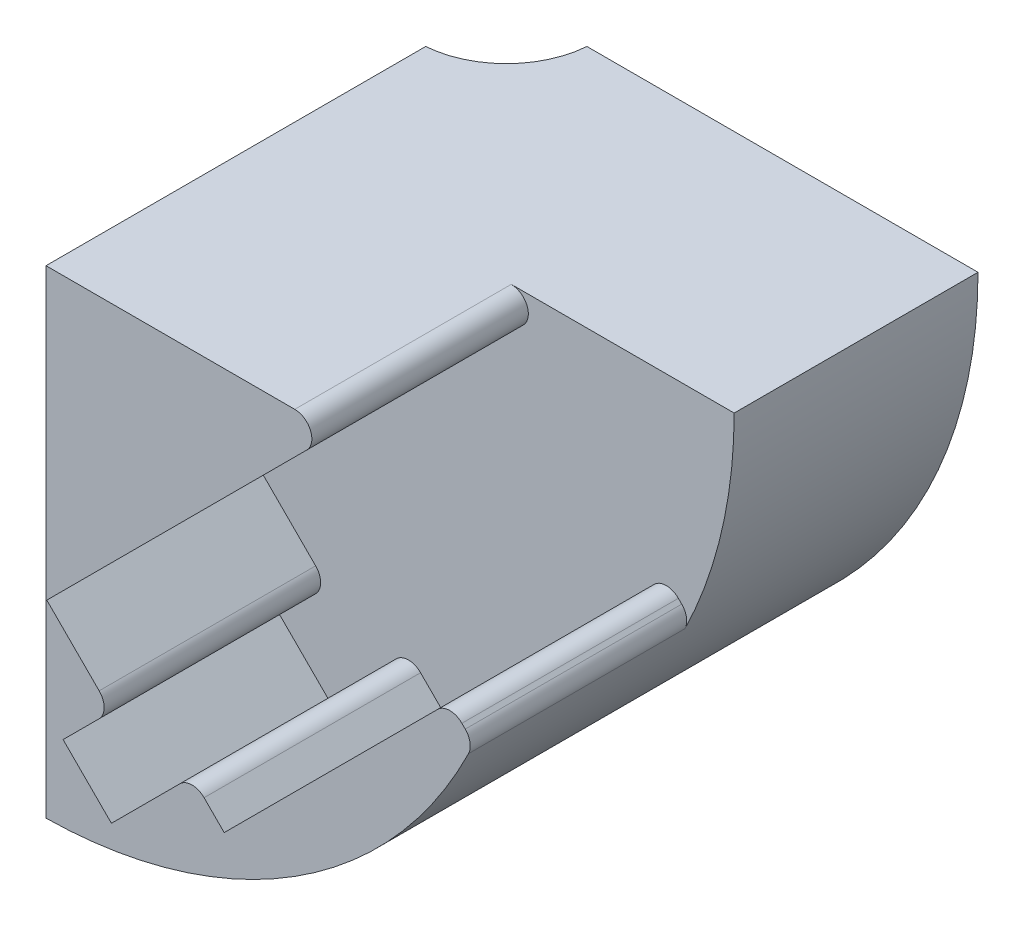
ISO-10303-21;
HEADER;
FILE_DESCRIPTION(('STEP AP214'),'2;1');
FILE_NAME('part.step','',(''),(''),'','','');
FILE_SCHEMA(('AUTOMOTIVE_DESIGN { 1 0 10303 214 1 1 1 1 }'));
ENDSEC;
DATA;
#1=APPLICATION_CONTEXT('core data for automotive mechanical design processes');
#2=APPLICATION_PROTOCOL_DEFINITION('international standard','automotive_design',2000,#1);
#3=PRODUCT_CONTEXT('',#1,'mechanical');
#4=PRODUCT('Part','Part','',(#3));
#5=PRODUCT_RELATED_PRODUCT_CATEGORY('part','',(#4));
#6=PRODUCT_DEFINITION_FORMATION('','',#4);
#7=PRODUCT_DEFINITION_CONTEXT('part definition',#1,'design');
#8=PRODUCT_DEFINITION('design','',#6,#7);
#9=PRODUCT_DEFINITION_SHAPE('','',#8);
#10=(LENGTH_UNIT() NAMED_UNIT(*) SI_UNIT(.MILLI.,.METRE.));
#11=(NAMED_UNIT(*) PLANE_ANGLE_UNIT() SI_UNIT($,.RADIAN.));
#12=(NAMED_UNIT(*) SI_UNIT($,.STERADIAN.) SOLID_ANGLE_UNIT());
#13=UNCERTAINTY_MEASURE_WITH_UNIT(LENGTH_MEASURE(1.E-05),#10,'distance_accuracy_value','');
#14=(GEOMETRIC_REPRESENTATION_CONTEXT(3) GLOBAL_UNCERTAINTY_ASSIGNED_CONTEXT((#13)) GLOBAL_UNIT_ASSIGNED_CONTEXT((#10,
#11,#12)) REPRESENTATION_CONTEXT('',''));
#15=CARTESIAN_POINT('',(0.,0.,0.));
#16=DIRECTION('',(0.,0.,1.));
#17=DIRECTION('',(1.,0.,0.));
#18=AXIS2_PLACEMENT_3D('',#15,#16,#17);
#19=CARTESIAN_POINT('',(0.,0.,41.));
#20=DIRECTION('',(0.,0.,1.));
#21=DIRECTION('',(1.,0.,0.));
#22=AXIS2_PLACEMENT_3D('',#19,#20,#21);
#23=PLANE('',#22);
#24=DIRECTION('',(-0.707106781186548,-0.707106781186548,0.));
#25=VECTOR('',#24,1.);
#26=CARTESIAN_POINT('',(18.6847763108502,-18.6847763108502,41.));
#27=LINE('',#26,#25);
#28=CARTESIAN_POINT('',(5.26690475583121,-32.1026478658693,41.));
#29=VERTEX_POINT('',#28);
#30=CARTESIAN_POINT('',(2.1,-35.2695526217005,41.));
#31=VERTEX_POINT('',#30);
#32=EDGE_CURVE('E209',#29,#31,#27,.T.);
#33=ORIENTED_EDGE('',*,*,#32,.F.);
#34=CARTESIAN_POINT('',(4.20624458405139,-31.0419876940894,41.));
#35=DIRECTION('',(0.,0.,1.));
#36=DIRECTION('',(1.,0.,0.));
#37=AXIS2_PLACEMENT_3D('',#34,#35,#36);
#38=CIRCLE('',#37,1.5);
#39=CARTESIAN_POINT('',(5.26690475583121,-29.9813275223096,41.));
#40=VERTEX_POINT('',#39);
#41=EDGE_CURVE('E186',#29,#40,#38,.T.);
#42=ORIENTED_EDGE('',*,*,#41,.T.);
#43=DIRECTION('',(0.707106781186547,-0.707106781186548,0.));
#44=VECTOR('',#43,1.);
#45=CARTESIAN_POINT('',(6.32756492761103,-31.0419876940894,41.));
#46=LINE('',#45,#44);
#47=CARTESIAN_POINT('',(0.670710678118652,-25.3851334445971,41.));
#48=VERTEX_POINT('',#47);
#49=EDGE_CURVE('E173',#48,#40,#46,.T.);
#50=ORIENTED_EDGE('',*,*,#49,.F.);
#51=DIRECTION('',(-0.707106781186548,-0.707106781186548,0.));
#52=VECTOR('',#51,1.);
#53=CARTESIAN_POINT('',(26.0558441227157,0.,41.));
#54=LINE('',#53,#52);
#55=CARTESIAN_POINT('',(23.4951839509359,-2.56066017177982,41.));
#56=VERTEX_POINT('',#55);
#57=EDGE_CURVE('E164',#56,#48,#54,.T.);
#58=ORIENTED_EDGE('',*,*,#57,.F.);
#59=CARTESIAN_POINT('',(22.4345237791561,-1.5,41.));
#60=DIRECTION('',(0.,0.,1.));
#61=DIRECTION('',(1.,0.,0.));
#62=AXIS2_PLACEMENT_3D('',#59,#60,#61);
#63=CIRCLE('',#62,1.5);
#64=CARTESIAN_POINT('',(22.4345237791561,0.,41.));
#65=VERTEX_POINT('',#64);
#66=EDGE_CURVE('E314',#56,#65,#63,.T.);
#67=ORIENTED_EDGE('',*,*,#66,.T.);
#68=DIRECTION('',(1.,0.,0.));
#69=VECTOR('',#68,1.);
#70=CARTESIAN_POINT('',(0.,0.,41.));
#71=LINE('',#70,#69);
#72=CARTESIAN_POINT('',(0.6,0.,41.));
#73=VERTEX_POINT('',#72);
#74=EDGE_CURVE('E249',#73,#65,#71,.T.);
#75=ORIENTED_EDGE('',*,*,#74,.F.);
#76=DIRECTION('',(0.,1.,0.));
#77=VECTOR('',#76,1.);
#78=CARTESIAN_POINT('',(0.6,-42.,41.));
#79=LINE('',#78,#77);
#80=CARTESIAN_POINT('',(0.6,-41.9957140670331,41.));
#81=VERTEX_POINT('',#80);
#82=EDGE_CURVE('E228',#81,#73,#79,.T.);
#83=ORIENTED_EDGE('',*,*,#82,.F.);
#84=CARTESIAN_POINT('',(0.,0.,41.));
#85=DIRECTION('',(0.,0.,1.));
#86=DIRECTION('',(1.,0.,0.));
#87=AXIS2_PLACEMENT_3D('',#84,#85,#86);
#88=CIRCLE('',#87,42.);
#89=CARTESIAN_POINT('',(37.6818639067726,-18.5493162275989,41.));
#90=VERTEX_POINT('',#89);
#91=EDGE_CURVE('E339',#81,#90,#88,.T.);
#92=ORIENTED_EDGE('',*,*,#91,.T.);
#93=CARTESIAN_POINT('',(36.3360830529593,-17.8868406480418,41.));
#94=DIRECTION('',(0.,0.,1.));
#95=DIRECTION('',(1.,0.,0.));
#96=AXIS2_PLACEMENT_3D('',#93,#94,#95);
#97=CIRCLE('',#96,1.5);
#98=CARTESIAN_POINT('',(37.3967432247391,-16.826180476262,41.));
#99=VERTEX_POINT('',#98);
#100=EDGE_CURVE('E291',#90,#99,#97,.T.);
#101=ORIENTED_EDGE('',*,*,#100,.T.);
#102=DIRECTION('',(0.707106781186548,-0.707106781186547,0.));
#103=VECTOR('',#102,1.);
#104=CARTESIAN_POINT('',(33.2126983722081,-12.6421356237309,41.));
#105=LINE('',#104,#103);
#106=CARTESIAN_POINT('',(37.1017856687341,-16.5312229202569,41.));
#107=VERTEX_POINT('',#106);
#108=EDGE_CURVE('E174',#107,#99,#105,.T.);
#109=ORIENTED_EDGE('',*,*,#108,.F.);
#110=CARTESIAN_POINT('',(36.0411254969543,-17.5918830920368,41.));
#111=DIRECTION('',(0.,0.,1.));
#112=DIRECTION('',(1.,0.,0.));
#113=AXIS2_PLACEMENT_3D('',#110,#111,#112);
#114=CIRCLE('',#113,1.5);
#115=CARTESIAN_POINT('',(34.9804653251744,-16.531222920257,41.));
#116=VERTEX_POINT('',#115);
#117=EDGE_CURVE('E328',#107,#116,#114,.T.);
#118=ORIENTED_EDGE('',*,*,#117,.T.);
#119=DIRECTION('',(-0.707106781186547,-0.707106781186548,0.));
#120=VECTOR('',#119,1.);
#121=CARTESIAN_POINT('',(25.7558441227157,-25.7558441227157,41.));
#122=LINE('',#121,#120);
#123=CARTESIAN_POINT('',(16.2421356237309,-35.2695526217005,41.));
#124=VERTEX_POINT('',#123);
#125=EDGE_CURVE('E192',#116,#124,#122,.T.);
#126=ORIENTED_EDGE('',*,*,#125,.T.);
#127=DIRECTION('',(0.707106781186548,-0.707106781186547,0.));
#128=VECTOR('',#127,1.);
#129=CARTESIAN_POINT('',(-9.51370849898477,-9.51370849898478,41.));
#130=LINE('',#129,#128);
#131=CARTESIAN_POINT('',(14.4743686707646,-33.5017856687341,41.));
#132=VERTEX_POINT('',#131);
#133=EDGE_CURVE('E196',#132,#124,#130,.T.);
#134=ORIENTED_EDGE('',*,*,#133,.F.);
#135=CARTESIAN_POINT('',(13.4137084989848,-34.5624458405139,41.));
#136=DIRECTION('',(0.,0.,1.));
#137=DIRECTION('',(1.,0.,0.));
#138=AXIS2_PLACEMENT_3D('',#135,#136,#137);
#139=CIRCLE('',#138,1.5);
#140=CARTESIAN_POINT('',(12.3530483272049,-33.5017856687341,41.));
#141=VERTEX_POINT('',#140);
#142=EDGE_CURVE('E324',#132,#141,#139,.T.);
#143=ORIENTED_EDGE('',*,*,#142,.T.);
#144=DIRECTION('',(-0.707106781186548,-0.707106781186548,0.));
#145=VECTOR('',#144,1.);
#146=CARTESIAN_POINT('',(22.9274169979695,-22.9274169979695,41.));
#147=LINE('',#146,#145);
#148=CARTESIAN_POINT('',(6.34264068711929,-39.5121933088197,41.));
#149=VERTEX_POINT('',#148);
#150=EDGE_CURVE('E210',#141,#149,#147,.T.);
#151=ORIENTED_EDGE('',*,*,#150,.T.);
#152=DIRECTION('',(-0.707106781186547,0.707106781186548,0.));
#153=VECTOR('',#152,1.);
#154=CARTESIAN_POINT('',(-16.5847763108502,-16.5847763108502,41.));
#155=LINE('',#154,#153);
#156=EDGE_CURVE('E212',#149,#31,#155,.T.);
#157=ORIENTED_EDGE('',*,*,#156,.T.);
#158=EDGE_LOOP('',(#33,#42,#50,#58,#67,#75,#83,#92,#101,#109,#118,#126,#134,#143,#151,#157));
#159=FACE_BOUND('',#158,.T.);
#160=ADVANCED_FACE('F38',(#159),#23,.T.);
#161=CARTESIAN_POINT('',(0.,0.,41.));
#162=DIRECTION('',(0.,0.,-1.));
#163=DIRECTION('',(-1.,0.,0.));
#164=AXIS2_PLACEMENT_3D('',#161,#162,#163);
#165=CYLINDRICAL_SURFACE('',#164,42.);
#166=CARTESIAN_POINT('',(0.,0.,22.));
#167=DIRECTION('',(0.,0.,1.));
#168=DIRECTION('',(1.,0.,0.));
#169=AXIS2_PLACEMENT_3D('',#166,#167,#168);
#170=CIRCLE('',#169,42.);
#171=CARTESIAN_POINT('',(42.,0.,22.));
#172=VERTEX_POINT('',#171);
#173=CARTESIAN_POINT('',(37.6818639067726,-18.5493162275989,22.));
#174=VERTEX_POINT('',#173);
#175=EDGE_CURVE('E183',#172,#174,#170,.F.);
#176=ORIENTED_EDGE('',*,*,#175,.T.);
#177=DIRECTION('',(0.,0.,-1.));
#178=VECTOR('',#177,1.);
#179=CARTESIAN_POINT('',(37.6818639067727,-18.5493162275989,41.));
#180=LINE('',#179,#178);
#181=EDGE_CURVE('E278',#174,#90,#180,.F.);
#182=ORIENTED_EDGE('',*,*,#181,.T.);
#183=ORIENTED_EDGE('',*,*,#91,.F.);
#184=DIRECTION('',(0.,0.,-1.));
#185=VECTOR('',#184,1.);
#186=CARTESIAN_POINT('',(0.6,-41.9957140670331,41.));
#187=LINE('',#186,#185);
#188=CARTESIAN_POINT('',(0.6,-41.9957140670331,7.6765877836445));
#189=VERTEX_POINT('',#188);
#190=EDGE_CURVE('E234',#81,#189,#187,.T.);
#191=ORIENTED_EDGE('',*,*,#190,.T.);
#192=CARTESIAN_POINT('',(0.,-42.,7.69999999999999));
#193=CARTESIAN_POINT('',(0.214661189812966,-42.0000163933078,7.70002522535463));
#194=CARTESIAN_POINT('',(0.429316458936862,-41.9983548762452,7.69102458371643));
#195=CARTESIAN_POINT('',(0.857056773200532,-41.9917948080387,7.65515552505157));
#196=CARTESIAN_POINT('',(1.07014198500119,-41.9868966056226,7.62828903292973));
#197=CARTESIAN_POINT('',(1.49292882316759,-41.9739911209351,7.55692311719224));
#198=CARTESIAN_POINT('',(1.70263484419704,-41.965988285519,7.5124489117479));
#199=CARTESIAN_POINT('',(2.1174887043463,-41.9471016115582,7.40621912778807));
#200=CARTESIAN_POINT('',(2.32263654143767,-41.9362177717316,7.34446354158237));
#201=CARTESIAN_POINT('',(2.72693909328696,-41.9118697789648,7.2041372814937));
#202=CARTESIAN_POINT('',(2.92609379229552,-41.8984056192444,7.12556656342662));
#203=CARTESIAN_POINT('',(3.31710988226874,-41.8692636087246,6.95216080587093));
#204=CARTESIAN_POINT('',(3.5089685532466,-41.853584942421,6.85731977197585));
#205=CARTESIAN_POINT('',(3.8839850808559,-41.820450675344,6.65209311551742));
#206=CARTESIAN_POINT('',(4.06714417652964,-41.802995328735,6.54170971551683));
#207=CARTESIAN_POINT('',(4.42356806732711,-41.7667827348401,6.30616192114487));
#208=CARTESIAN_POINT('',(4.59683252801584,-41.7480254435964,6.18099702760266));
#209=CARTESIAN_POINT('',(4.93400694104062,-41.709527252614,5.91541168212752));
#210=CARTESIAN_POINT('',(5.09780448389459,-41.6897783199113,5.77484966551783));
#211=CARTESIAN_POINT('',(5.41301119696934,-41.6500246179644,5.48049367544318));
#212=CARTESIAN_POINT('',(5.56442028794676,-41.6300198470847,5.32669961735172));
#213=CARTESIAN_POINT('',(5.85384815061183,-41.5903090754971,5.00689345896104));
#214=CARTESIAN_POINT('',(5.99186410635733,-41.5706031383515,4.84087880209617));
#215=CARTESIAN_POINT('',(6.25351302726115,-41.5320486777089,4.49779020667886));
#216=CARTESIAN_POINT('',(6.3771463316427,-41.5132001339963,4.32071652911134));
#217=CARTESIAN_POINT('',(6.61009361533324,-41.476748652319,3.95524876227588));
#218=CARTESIAN_POINT('',(6.71928498997473,-41.4591568985644,3.76677537082252));
#219=CARTESIAN_POINT('',(6.92133519733714,-41.4259049697142,3.38119503404902));
#220=CARTESIAN_POINT('',(7.0142000108884,-41.4102440879221,3.18409128343498));
#221=CARTESIAN_POINT('',(7.18291728741062,-41.3813126096725,2.78263817543174));
#222=CARTESIAN_POINT('',(7.25877609459446,-41.3680411221993,2.57829155310602));
#223=CARTESIAN_POINT('',(7.39291955762718,-41.3442784833262,2.16384029875247));
#224=CARTESIAN_POINT('',(7.45120850697619,-41.3337866527449,1.95373708715971));
#225=CARTESIAN_POINT('',(7.56669579487874,-41.3128279305321,1.45626018583863));
#226=CARTESIAN_POINT('',(7.61666221576772,-41.3036039817758,1.16710148292995));
#227=CARTESIAN_POINT('',(7.66664585316107,-41.2943431982756,0.730756565595945));
#228=CARTESIAN_POINT('',(7.67914605345211,-41.2920188085843,0.584928207318106));
#229=CARTESIAN_POINT('',(7.6958234407679,-41.2889130888019,0.292746587087686));
#230=CARTESIAN_POINT('',(7.69999872929735,-41.288132110686,0.146393213026887));
#231=CARTESIAN_POINT('',(7.7,-41.2881338885642,0.));
#232=B_SPLINE_CURVE_WITH_KNOTS('',3,(#192,#193,#194,#195,#196,#197,#198,#199,#200,#201,#202,
#203,#204,#205,#206,#207,#208,#209,#210,#211,#212,#213,#214,#215,#216,#217,#218,#219,#220,#221,
#222,#223,#224,#225,#226,#227,#228,#229,#230,#231),.UNSPECIFIED.,.F.,.F.,(4,2,2,2,2,2,2,2,2,2,2,
2,2,2,2,2,2,2,2,4),(0.,0.643779697213744,1.28749004346622,1.93028176892669,2.57307378042971,
3.21586748097861,3.85889851400501,4.5018376866233,5.14479857750093,5.79426608670598,
6.44373774993785,7.09334567177995,7.74293826913184,8.39773308887107,9.05228753870625,
9.70659739443971,10.3607472283209,11.2392736650466,11.678212268625,12.1172509606643),.UNSPECIFIED.);
#233=CARTESIAN_POINT('',(7.6765877836445,-41.2924932645148,0.600000000000001));
#234=VERTEX_POINT('',#233);
#235=EDGE_CURVE('E240',#189,#234,#232,.T.);
#236=ORIENTED_EDGE('',*,*,#235,.T.);
#237=CARTESIAN_POINT('',(0.,0.,0.599999999999996));
#238=DIRECTION('',(0.,0.,1.));
#239=DIRECTION('',(1.,0.,0.));
#240=AXIS2_PLACEMENT_3D('',#237,#238,#239);
#241=CIRCLE('',#240,42.);
#242=CARTESIAN_POINT('',(42.,0.,0.599999999999998));
#243=VERTEX_POINT('',#242);
#244=EDGE_CURVE('E230',#234,#243,#241,.T.);
#245=ORIENTED_EDGE('',*,*,#244,.T.);
#246=DIRECTION('',(0.,0.,1.));
#247=VECTOR('',#246,1.);
#248=CARTESIAN_POINT('',(42.,0.,0.));
#249=LINE('',#248,#247);
#250=EDGE_CURVE('E281',#243,#172,#249,.T.);
#251=ORIENTED_EDGE('',*,*,#250,.T.);
#252=EDGE_LOOP('',(#176,#182,#183,#191,#236,#245,#251));
#253=FACE_BOUND('',#252,.T.);
#254=ADVANCED_FACE('F251',(#253),#165,.T.);
#255=CARTESIAN_POINT('',(0.,0.,0.));
#256=DIRECTION('',(0.,-1.,0.));
#257=DIRECTION('',(0.,0.,-1.));
#258=AXIS2_PLACEMENT_3D('',#255,#256,#257);
#259=PLANE('',#258);
#260=ORIENTED_EDGE('',*,*,#74,.T.);
#261=DIRECTION('',(0.,0.,1.));
#262=VECTOR('',#261,1.);
#263=CARTESIAN_POINT('',(22.4345237791561,0.,0.));
#264=LINE('',#263,#262);
#265=CARTESIAN_POINT('',(22.4345237791561,0.,22.));
#266=VERTEX_POINT('',#265);
#267=EDGE_CURVE('E293',#65,#266,#264,.F.);
#268=ORIENTED_EDGE('',*,*,#267,.T.);
#269=DIRECTION('',(1.,0.,0.));
#270=VECTOR('',#269,1.);
#271=CARTESIAN_POINT('',(26.0558441227157,0.,22.));
#272=LINE('',#271,#270);
#273=EDGE_CURVE('E283',#266,#172,#272,.T.);
#274=ORIENTED_EDGE('',*,*,#273,.T.);
#275=ORIENTED_EDGE('',*,*,#250,.F.);
#276=DIRECTION('',(1.,0.,0.));
#277=VECTOR('',#276,1.);
#278=CARTESIAN_POINT('',(42.,0.,0.599999999999998));
#279=LINE('',#278,#277);
#280=CARTESIAN_POINT('',(7.6765877836445,0.,0.600000000000001));
#281=VERTEX_POINT('',#280);
#282=EDGE_CURVE('E220',#281,#243,#279,.T.);
#283=ORIENTED_EDGE('',*,*,#282,.F.);
#284=CARTESIAN_POINT('',(0.,0.,0.));
#285=DIRECTION('',(0.,1.,0.));
#286=DIRECTION('',(0.,0.,1.));
#287=AXIS2_PLACEMENT_3D('',#284,#285,#286);
#288=CIRCLE('',#287,7.7);
#289=CARTESIAN_POINT('',(0.6,0.,7.6765877836445));
#290=VERTEX_POINT('',#289);
#291=EDGE_CURVE('E237',#290,#281,#288,.T.);
#292=ORIENTED_EDGE('',*,*,#291,.F.);
#293=DIRECTION('',(0.,0.,-1.));
#294=VECTOR('',#293,1.);
#295=CARTESIAN_POINT('',(0.6,0.,41.));
#296=LINE('',#295,#294);
#297=EDGE_CURVE('E226',#73,#290,#296,.T.);
#298=ORIENTED_EDGE('',*,*,#297,.F.);
#299=EDGE_LOOP('',(#260,#268,#274,#275,#283,#292,#298));
#300=FACE_BOUND('',#299,.T.);
#301=ADVANCED_FACE('F261',(#300),#259,.F.);
#302=CARTESIAN_POINT('',(0.,-42.,0.));
#303=DIRECTION('',(0.,1.,0.));
#304=DIRECTION('',(0.,0.,1.));
#305=AXIS2_PLACEMENT_3D('',#302,#303,#304);
#306=CYLINDRICAL_SURFACE('',#305,7.7);
#307=ORIENTED_EDGE('',*,*,#235,.F.);
#308=DIRECTION('',(0.,1.,0.));
#309=VECTOR('',#308,1.);
#310=CARTESIAN_POINT('',(0.6,-42.,7.6765877836445));
#311=LINE('',#310,#309);
#312=EDGE_CURVE('E333',#189,#290,#311,.T.);
#313=ORIENTED_EDGE('',*,*,#312,.T.);
#314=ORIENTED_EDGE('',*,*,#291,.T.);
#315=DIRECTION('',(0.,1.,0.));
#316=VECTOR('',#315,1.);
#317=CARTESIAN_POINT('',(7.6765877836445,-42.,0.600000000000001));
#318=LINE('',#317,#316);
#319=EDGE_CURVE('E336',#281,#234,#318,.F.);
#320=ORIENTED_EDGE('',*,*,#319,.T.);
#321=EDGE_LOOP('',(#307,#313,#314,#320));
#322=FACE_BOUND('',#321,.T.);
#323=ADVANCED_FACE('F255',(#322),#306,.F.);
#324=CARTESIAN_POINT('',(42.,-42.,0.599999999999998));
#325=DIRECTION('',(0.,0.,1.));
#326=DIRECTION('',(1.,0.,0.));
#327=AXIS2_PLACEMENT_3D('',#324,#325,#326);
#328=PLANE('',#327);
#329=ORIENTED_EDGE('',*,*,#319,.F.);
#330=ORIENTED_EDGE('',*,*,#282,.T.);
#331=ORIENTED_EDGE('',*,*,#244,.F.);
#332=EDGE_LOOP('',(#329,#330,#331));
#333=FACE_BOUND('',#332,.T.);
#334=ADVANCED_FACE('F260',(#333),#328,.F.);
#335=CARTESIAN_POINT('',(0.6,-42.,41.));
#336=DIRECTION('',(1.,0.,0.));
#337=DIRECTION('',(0.,0.,-1.));
#338=AXIS2_PLACEMENT_3D('',#335,#336,#337);
#339=PLANE('',#338);
#340=ORIENTED_EDGE('',*,*,#82,.T.);
#341=ORIENTED_EDGE('',*,*,#297,.T.);
#342=ORIENTED_EDGE('',*,*,#312,.F.);
#343=ORIENTED_EDGE('',*,*,#190,.F.);
#344=EDGE_LOOP('',(#340,#341,#342,#343));
#345=FACE_BOUND('',#344,.T.);
#346=ADVANCED_FACE('F407',(#345),#339,.F.);
#347=CARTESIAN_POINT('',(25.7558441227157,-25.7558441227157,22.));
#348=DIRECTION('',(-0.707106781186548,0.707106781186547,0.));
#349=DIRECTION('',(-0.707106781186547,-0.707106781186548,0.));
#350=AXIS2_PLACEMENT_3D('',#347,#348,#349);
#351=PLANE('',#350);
#352=ORIENTED_EDGE('',*,*,#125,.F.);
#353=DIRECTION('',(0.,0.,1.));
#354=VECTOR('',#353,1.);
#355=CARTESIAN_POINT('',(34.9804653251744,-16.5312229202569,22.));
#356=LINE('',#355,#354);
#357=CARTESIAN_POINT('',(34.9804653251744,-16.531222920257,22.));
#358=VERTEX_POINT('',#357);
#359=EDGE_CURVE('E53',#116,#358,#356,.F.);
#360=ORIENTED_EDGE('',*,*,#359,.T.);
#361=DIRECTION('',(-0.707106781186547,-0.707106781186548,0.));
#362=VECTOR('',#361,1.);
#363=CARTESIAN_POINT('',(25.7558441227157,-25.7558441227157,22.));
#364=LINE('',#363,#362);
#365=CARTESIAN_POINT('',(16.2421356237309,-35.2695526217005,22.));
#366=VERTEX_POINT('',#365);
#367=EDGE_CURVE('E193',#358,#366,#364,.T.);
#368=ORIENTED_EDGE('',*,*,#367,.T.);
#369=DIRECTION('',(0.,0.,1.));
#370=VECTOR('',#369,1.);
#371=CARTESIAN_POINT('',(16.2421356237309,-35.2695526217005,22.));
#372=LINE('',#371,#370);
#373=EDGE_CURVE('E217',#366,#124,#372,.T.);
#374=ORIENTED_EDGE('',*,*,#373,.T.);
#375=EDGE_LOOP('',(#352,#360,#368,#374));
#376=FACE_BOUND('',#375,.T.);
#377=ADVANCED_FACE('F358',(#376),#351,.T.);
#378=CARTESIAN_POINT('',(-9.51370849898477,-9.51370849898478,22.));
#379=DIRECTION('',(-0.707106781186547,-0.707106781186548,0.));
#380=DIRECTION('',(0.707106781186548,-0.707106781186547,0.));
#381=AXIS2_PLACEMENT_3D('',#378,#379,#380);
#382=PLANE('',#381);
#383=DIRECTION('',(0.707106781186548,-0.707106781186547,0.));
#384=VECTOR('',#383,1.);
#385=CARTESIAN_POINT('',(-9.51370849898477,-9.51370849898478,22.));
#386=LINE('',#385,#384);
#387=CARTESIAN_POINT('',(14.4743686707646,-33.5017856687341,22.));
#388=VERTEX_POINT('',#387);
#389=EDGE_CURVE('E199',#388,#366,#386,.T.);
#390=ORIENTED_EDGE('',*,*,#389,.F.);
#391=DIRECTION('',(0.,0.,1.));
#392=VECTOR('',#391,1.);
#393=CARTESIAN_POINT('',(14.4743686707646,-33.5017856687341,41.));
#394=LINE('',#393,#392);
#395=EDGE_CURVE('E316',#388,#132,#394,.T.);
#396=ORIENTED_EDGE('',*,*,#395,.T.);
#397=ORIENTED_EDGE('',*,*,#133,.T.);
#398=ORIENTED_EDGE('',*,*,#373,.F.);
#399=EDGE_LOOP('',(#390,#396,#397,#398));
#400=FACE_BOUND('',#399,.T.);
#401=ADVANCED_FACE('F399',(#400),#382,.F.);
#402=CARTESIAN_POINT('',(22.9274169979695,-22.9274169979695,22.));
#403=DIRECTION('',(-0.707106781186548,0.707106781186548,0.));
#404=DIRECTION('',(-0.707106781186548,-0.707106781186548,0.));
#405=AXIS2_PLACEMENT_3D('',#402,#403,#404);
#406=PLANE('',#405);
#407=ORIENTED_EDGE('',*,*,#150,.F.);
#408=DIRECTION('',(0.,0.,1.));
#409=VECTOR('',#408,1.);
#410=CARTESIAN_POINT('',(12.3530483272049,-33.5017856687341,22.));
#411=LINE('',#410,#409);
#412=CARTESIAN_POINT('',(12.3530483272049,-33.5017856687341,22.));
#413=VERTEX_POINT('',#412);
#414=EDGE_CURVE('E315',#141,#413,#411,.F.);
#415=ORIENTED_EDGE('',*,*,#414,.T.);
#416=DIRECTION('',(-0.707106781186548,-0.707106781186548,0.));
#417=VECTOR('',#416,1.);
#418=CARTESIAN_POINT('',(22.9274169979695,-22.9274169979695,22.));
#419=LINE('',#418,#417);
#420=CARTESIAN_POINT('',(6.34264068711929,-39.5121933088197,22.));
#421=VERTEX_POINT('',#420);
#422=EDGE_CURVE('E197',#413,#421,#419,.T.);
#423=ORIENTED_EDGE('',*,*,#422,.T.);
#424=DIRECTION('',(0.,0.,1.));
#425=VECTOR('',#424,1.);
#426=CARTESIAN_POINT('',(6.34264068711929,-39.5121933088197,22.));
#427=LINE('',#426,#425);
#428=EDGE_CURVE('E221',#421,#149,#427,.T.);
#429=ORIENTED_EDGE('',*,*,#428,.T.);
#430=EDGE_LOOP('',(#407,#415,#423,#429));
#431=FACE_BOUND('',#430,.T.);
#432=ADVANCED_FACE('F393',(#431),#406,.T.);
#433=CARTESIAN_POINT('',(-16.5847763108502,-16.5847763108502,22.));
#434=DIRECTION('',(0.707106781186548,0.707106781186547,0.));
#435=DIRECTION('',(-0.707106781186547,0.707106781186548,0.));
#436=AXIS2_PLACEMENT_3D('',#433,#434,#435);
#437=PLANE('',#436);
#438=ORIENTED_EDGE('',*,*,#156,.F.);
#439=ORIENTED_EDGE('',*,*,#428,.F.);
#440=DIRECTION('',(-0.707106781186547,0.707106781186548,0.));
#441=VECTOR('',#440,1.);
#442=CARTESIAN_POINT('',(-16.5847763108502,-16.5847763108502,22.));
#443=LINE('',#442,#441);
#444=CARTESIAN_POINT('',(2.1,-35.2695526217005,22.));
#445=VERTEX_POINT('',#444);
#446=EDGE_CURVE('E200',#421,#445,#443,.T.);
#447=ORIENTED_EDGE('',*,*,#446,.T.);
#448=DIRECTION('',(0.,0.,1.));
#449=VECTOR('',#448,1.);
#450=CARTESIAN_POINT('',(2.1,-35.2695526217005,22.));
#451=LINE('',#450,#449);
#452=EDGE_CURVE('E206',#445,#31,#451,.T.);
#453=ORIENTED_EDGE('',*,*,#452,.T.);
#454=EDGE_LOOP('',(#438,#439,#447,#453));
#455=FACE_BOUND('',#454,.T.);
#456=ADVANCED_FACE('F388',(#455),#437,.T.);
#457=CARTESIAN_POINT('',(18.6847763108502,-18.6847763108502,22.));
#458=DIRECTION('',(-0.707106781186548,0.707106781186548,0.));
#459=DIRECTION('',(-0.707106781186548,-0.707106781186548,0.));
#460=AXIS2_PLACEMENT_3D('',#457,#458,#459);
#461=PLANE('',#460);
#462=DIRECTION('',(-0.707106781186548,-0.707106781186548,0.));
#463=VECTOR('',#462,1.);
#464=CARTESIAN_POINT('',(18.6847763108502,-18.6847763108502,22.));
#465=LINE('',#464,#463);
#466=CARTESIAN_POINT('',(5.26690475583121,-32.1026478658693,22.));
#467=VERTEX_POINT('',#466);
#468=EDGE_CURVE('E195',#467,#445,#465,.T.);
#469=ORIENTED_EDGE('',*,*,#468,.F.);
#470=DIRECTION('',(0.,0.,1.));
#471=VECTOR('',#470,1.);
#472=CARTESIAN_POINT('',(5.26690475583121,-32.1026478658693,22.));
#473=LINE('',#472,#471);
#474=EDGE_CURVE('E330',#467,#29,#473,.T.);
#475=ORIENTED_EDGE('',*,*,#474,.T.);
#476=ORIENTED_EDGE('',*,*,#32,.T.);
#477=ORIENTED_EDGE('',*,*,#452,.F.);
#478=EDGE_LOOP('',(#469,#475,#476,#477));
#479=FACE_BOUND('',#478,.T.);
#480=ADVANCED_FACE('F385',(#479),#461,.F.);
#481=CARTESIAN_POINT('',(0.,0.,22.));
#482=DIRECTION('',(0.,0.,1.));
#483=DIRECTION('',(1.,0.,0.));
#484=AXIS2_PLACEMENT_3D('',#481,#482,#483);
#485=PLANE('',#484);
#486=DIRECTION('',(-0.707106781186547,0.707106781186548,0.));
#487=VECTOR('',#486,1.);
#488=CARTESIAN_POINT('',(6.32756492761103,-31.0419876940894,22.));
#489=LINE('',#488,#487);
#490=CARTESIAN_POINT('',(5.26690475583121,-29.9813275223096,22.));
#491=VERTEX_POINT('',#490);
#492=CARTESIAN_POINT('',(0.670710678118653,-25.3851334445971,22.));
#493=VERTEX_POINT('',#492);
#494=EDGE_CURVE('E181',#491,#493,#489,.T.);
#495=ORIENTED_EDGE('',*,*,#494,.F.);
#496=CARTESIAN_POINT('',(4.20624458405139,-31.0419876940894,22.));
#497=DIRECTION('',(0.,0.,1.));
#498=DIRECTION('',(1.,0.,0.));
#499=AXIS2_PLACEMENT_3D('',#496,#497,#498);
#500=CIRCLE('',#499,1.5);
#501=EDGE_CURVE('E304',#491,#467,#500,.F.);
#502=ORIENTED_EDGE('',*,*,#501,.T.);
#503=ORIENTED_EDGE('',*,*,#468,.T.);
#504=ORIENTED_EDGE('',*,*,#446,.F.);
#505=ORIENTED_EDGE('',*,*,#422,.F.);
#506=CARTESIAN_POINT('',(13.4137084989848,-34.5624458405139,22.));
#507=DIRECTION('',(0.,0.,1.));
#508=DIRECTION('',(1.,0.,0.));
#509=AXIS2_PLACEMENT_3D('',#506,#507,#508);
#510=CIRCLE('',#509,1.5);
#511=EDGE_CURVE('E306',#413,#388,#510,.F.);
#512=ORIENTED_EDGE('',*,*,#511,.T.);
#513=ORIENTED_EDGE('',*,*,#389,.T.);
#514=ORIENTED_EDGE('',*,*,#367,.F.);
#515=CARTESIAN_POINT('',(36.0411254969543,-17.5918830920368,22.));
#516=DIRECTION('',(0.,0.,1.));
#517=DIRECTION('',(1.,0.,0.));
#518=AXIS2_PLACEMENT_3D('',#515,#516,#517);
#519=CIRCLE('',#518,1.5);
#520=CARTESIAN_POINT('',(37.1017856687341,-16.5312229202569,22.));
#521=VERTEX_POINT('',#520);
#522=EDGE_CURVE('E11',#358,#521,#519,.F.);
#523=ORIENTED_EDGE('',*,*,#522,.T.);
#524=DIRECTION('',(-0.707106781186548,0.707106781186547,0.));
#525=VECTOR('',#524,1.);
#526=CARTESIAN_POINT('',(33.2126983722081,-12.6421356237309,22.));
#527=LINE('',#526,#525);
#528=CARTESIAN_POINT('',(37.3967432247391,-16.826180476262,22.));
#529=VERTEX_POINT('',#528);
#530=EDGE_CURVE('E190',#529,#521,#527,.T.);
#531=ORIENTED_EDGE('',*,*,#530,.F.);
#532=CARTESIAN_POINT('',(36.3360830529593,-17.8868406480418,22.));
#533=DIRECTION('',(0.,0.,1.));
#534=DIRECTION('',(1.,0.,0.));
#535=AXIS2_PLACEMENT_3D('',#532,#533,#534);
#536=CIRCLE('',#535,1.5);
#537=EDGE_CURVE('E46',#529,#174,#536,.F.);
#538=ORIENTED_EDGE('',*,*,#537,.T.);
#539=ORIENTED_EDGE('',*,*,#175,.F.);
#540=ORIENTED_EDGE('',*,*,#273,.F.);
#541=CARTESIAN_POINT('',(22.4345237791561,-1.5,22.));
#542=DIRECTION('',(0.,0.,1.));
#543=DIRECTION('',(1.,0.,0.));
#544=AXIS2_PLACEMENT_3D('',#541,#542,#543);
#545=CIRCLE('',#544,1.5);
#546=CARTESIAN_POINT('',(23.4951839509359,-2.56066017177982,22.));
#547=VERTEX_POINT('',#546);
#548=EDGE_CURVE('E289',#266,#547,#545,.F.);
#549=ORIENTED_EDGE('',*,*,#548,.T.);
#550=DIRECTION('',(0.707106781186548,0.707106781186548,0.));
#551=VECTOR('',#550,1.);
#552=CARTESIAN_POINT('',(26.0558441227157,0.,22.));
#553=LINE('',#552,#551);
#554=EDGE_CURVE('E309',#493,#547,#553,.T.);
#555=ORIENTED_EDGE('',*,*,#554,.F.);
#556=EDGE_LOOP('',(#495,#502,#503,#504,#505,#512,#513,#514,#523,#531,#538,#539,#540,#549,#555));
#557=FACE_BOUND('',#556,.T.);
#558=ADVANCED_FACE('F286',(#557),#485,.T.);
#559=CARTESIAN_POINT('',(6.32756492761103,-31.0419876940894,-29.6886366221027));
#560=DIRECTION('',(-0.707106781186548,-0.707106781186547,0.));
#561=DIRECTION('',(0.707106781186547,-0.707106781186548,0.));
#562=AXIS2_PLACEMENT_3D('',#559,#560,#561);
#563=PLANE('',#562);
#564=ORIENTED_EDGE('',*,*,#49,.T.);
#565=DIRECTION('',(0.,0.,1.));
#566=VECTOR('',#565,1.);
#567=CARTESIAN_POINT('',(5.26690475583121,-29.9813275223096,-29.6886366221027));
#568=LINE('',#567,#566);
#569=EDGE_CURVE('E321',#40,#491,#568,.F.);
#570=ORIENTED_EDGE('',*,*,#569,.T.);
#571=ORIENTED_EDGE('',*,*,#494,.T.);
#572=DIRECTION('',(0.,0.,1.));
#573=VECTOR('',#572,1.);
#574=CARTESIAN_POINT('',(0.670710678118652,-25.3851334445971,-29.6886366221027));
#575=LINE('',#574,#573);
#576=EDGE_CURVE('E168',#493,#48,#575,.T.);
#577=ORIENTED_EDGE('',*,*,#576,.T.);
#578=EDGE_LOOP('',(#564,#570,#571,#577));
#579=FACE_BOUND('',#578,.T.);
#580=ADVANCED_FACE('F178',(#579),#563,.F.);
#581=CARTESIAN_POINT('',(26.0558441227157,0.,-29.6886366221027));
#582=DIRECTION('',(-0.707106781186548,0.707106781186548,0.));
#583=DIRECTION('',(-0.707106781186548,-0.707106781186548,0.));
#584=AXIS2_PLACEMENT_3D('',#581,#582,#583);
#585=PLANE('',#584);
#586=ORIENTED_EDGE('',*,*,#554,.T.);
#587=DIRECTION('',(0.,0.,1.));
#588=VECTOR('',#587,1.);
#589=CARTESIAN_POINT('',(23.4951839509359,-2.56066017177982,-29.6886366221027));
#590=LINE('',#589,#588);
#591=EDGE_CURVE('E170',#547,#56,#590,.T.);
#592=ORIENTED_EDGE('',*,*,#591,.T.);
#593=ORIENTED_EDGE('',*,*,#57,.T.);
#594=ORIENTED_EDGE('',*,*,#576,.F.);
#595=EDGE_LOOP('',(#586,#592,#593,#594));
#596=FACE_BOUND('',#595,.T.);
#597=ADVANCED_FACE('F167',(#596),#585,.F.);
#598=CARTESIAN_POINT('',(33.2126983722081,-12.6421356237309,-29.6886366221027));
#599=DIRECTION('',(-0.707106781186547,-0.707106781186548,0.));
#600=DIRECTION('',(0.707106781186548,-0.707106781186547,0.));
#601=AXIS2_PLACEMENT_3D('',#598,#599,#600);
#602=PLANE('',#601);
#603=ORIENTED_EDGE('',*,*,#108,.T.);
#604=DIRECTION('',(0.,0.,-1.));
#605=VECTOR('',#604,1.);
#606=CARTESIAN_POINT('',(37.3967432247391,-16.826180476262,-29.6886366221027));
#607=LINE('',#606,#605);
#608=EDGE_CURVE('E296',#99,#529,#607,.T.);
#609=ORIENTED_EDGE('',*,*,#608,.T.);
#610=ORIENTED_EDGE('',*,*,#530,.T.);
#611=DIRECTION('',(0.,0.,1.));
#612=VECTOR('',#611,1.);
#613=CARTESIAN_POINT('',(37.1017856687341,-16.5312229202569,41.));
#614=LINE('',#613,#612);
#615=EDGE_CURVE('E292',#521,#107,#614,.T.);
#616=ORIENTED_EDGE('',*,*,#615,.T.);
#617=EDGE_LOOP('',(#603,#609,#610,#616));
#618=FACE_BOUND('',#617,.T.);
#619=ADVANCED_FACE('F354',(#618),#602,.F.);
#620=CARTESIAN_POINT('',(4.20624458405139,-31.0419876940894,22.));
#621=DIRECTION('',(0.,0.,1.));
#622=DIRECTION('',(1.,0.,0.));
#623=AXIS2_PLACEMENT_3D('',#620,#621,#622);
#624=CYLINDRICAL_SURFACE('',#623,1.5);
#625=ORIENTED_EDGE('',*,*,#501,.F.);
#626=ORIENTED_EDGE('',*,*,#569,.F.);
#627=ORIENTED_EDGE('',*,*,#41,.F.);
#628=ORIENTED_EDGE('',*,*,#474,.F.);
#629=EDGE_LOOP('',(#625,#626,#627,#628));
#630=FACE_BOUND('',#629,.T.);
#631=ADVANCED_FACE('F371',(#630),#624,.T.);
#632=CARTESIAN_POINT('',(13.4137084989848,-34.5624458405139,22.));
#633=DIRECTION('',(0.,0.,-1.));
#634=DIRECTION('',(-1.,0.,0.));
#635=AXIS2_PLACEMENT_3D('',#632,#633,#634);
#636=CYLINDRICAL_SURFACE('',#635,1.5);
#637=ORIENTED_EDGE('',*,*,#511,.F.);
#638=ORIENTED_EDGE('',*,*,#414,.F.);
#639=ORIENTED_EDGE('',*,*,#142,.F.);
#640=ORIENTED_EDGE('',*,*,#395,.F.);
#641=EDGE_LOOP('',(#637,#638,#639,#640));
#642=FACE_BOUND('',#641,.T.);
#643=ADVANCED_FACE('F367',(#642),#636,.T.);
#644=CARTESIAN_POINT('',(22.4345237791561,-1.5,-29.6886366221027));
#645=DIRECTION('',(0.,0.,1.));
#646=DIRECTION('',(1.,0.,0.));
#647=AXIS2_PLACEMENT_3D('',#644,#645,#646);
#648=CYLINDRICAL_SURFACE('',#647,1.5);
#649=ORIENTED_EDGE('',*,*,#548,.F.);
#650=ORIENTED_EDGE('',*,*,#267,.F.);
#651=ORIENTED_EDGE('',*,*,#66,.F.);
#652=ORIENTED_EDGE('',*,*,#591,.F.);
#653=EDGE_LOOP('',(#649,#650,#651,#652));
#654=FACE_BOUND('',#653,.T.);
#655=ADVANCED_FACE('F313',(#654),#648,.T.);
#656=CARTESIAN_POINT('',(36.3360830529593,-17.8868406480418,41.));
#657=DIRECTION('',(0.,0.,-1.));
#658=DIRECTION('',(-1.,0.,0.));
#659=AXIS2_PLACEMENT_3D('',#656,#657,#658);
#660=CYLINDRICAL_SURFACE('',#659,1.5);
#661=ORIENTED_EDGE('',*,*,#537,.F.);
#662=ORIENTED_EDGE('',*,*,#608,.F.);
#663=ORIENTED_EDGE('',*,*,#100,.F.);
#664=ORIENTED_EDGE('',*,*,#181,.F.);
#665=EDGE_LOOP('',(#661,#662,#663,#664));
#666=FACE_BOUND('',#665,.T.);
#667=ADVANCED_FACE('F290',(#666),#660,.T.);
#668=CARTESIAN_POINT('',(36.0411254969543,-17.5918830920368,-29.6886366221027));
#669=DIRECTION('',(0.,0.,-1.));
#670=DIRECTION('',(-1.,0.,0.));
#671=AXIS2_PLACEMENT_3D('',#668,#669,#670);
#672=CYLINDRICAL_SURFACE('',#671,1.5);
#673=ORIENTED_EDGE('',*,*,#522,.F.);
#674=ORIENTED_EDGE('',*,*,#359,.F.);
#675=ORIENTED_EDGE('',*,*,#117,.F.);
#676=ORIENTED_EDGE('',*,*,#615,.F.);
#677=EDGE_LOOP('',(#673,#674,#675,#676));
#678=FACE_BOUND('',#677,.T.);
#679=ADVANCED_FACE('F40',(#678),#672,.T.);
#680=CLOSED_SHELL('',(#160,#254,#301,#323,#334,#346,#377,#401,#432,#456,#480,#558,#580,#597,
#619,#631,#643,#655,#667,#679));
#681=MANIFOLD_SOLID_BREP('B2',#680);
#682=ADVANCED_BREP_SHAPE_REPRESENTATION('',(#18,#681),#14);
#683=SHAPE_DEFINITION_REPRESENTATION(#9,#682);
ENDSEC;
END-ISO-10303-21;
